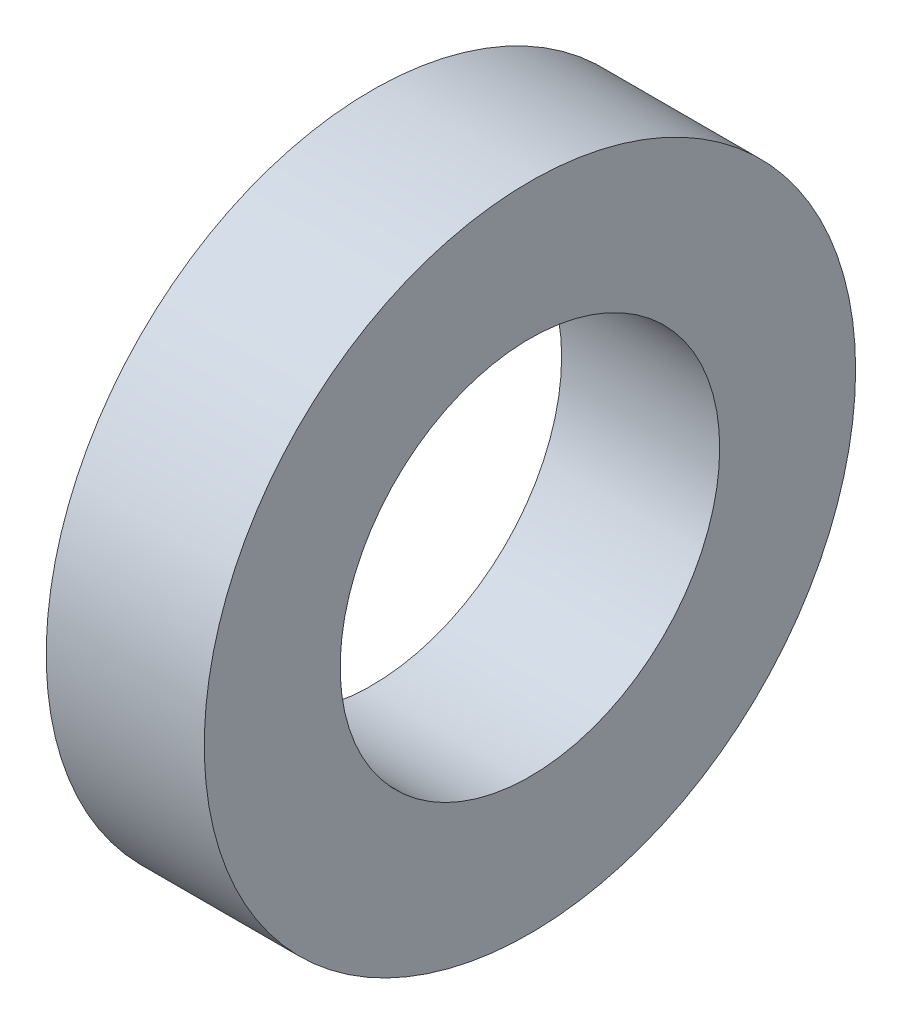
ISO-10303-21;
HEADER;
FILE_DESCRIPTION(('STEP AP214'),'2;1');
FILE_NAME('part.step','',(''),(''),'','','');
FILE_SCHEMA(('AUTOMOTIVE_DESIGN { 1 0 10303 214 1 1 1 1 }'));
ENDSEC;
DATA;
#1=APPLICATION_CONTEXT('core data for automotive mechanical design processes');
#2=APPLICATION_PROTOCOL_DEFINITION('international standard','automotive_design',2000,#1);
#3=PRODUCT_CONTEXT('',#1,'mechanical');
#4=PRODUCT('Part','Part','',(#3));
#5=PRODUCT_RELATED_PRODUCT_CATEGORY('part','',(#4));
#6=PRODUCT_DEFINITION_FORMATION('','',#4);
#7=PRODUCT_DEFINITION_CONTEXT('part definition',#1,'design');
#8=PRODUCT_DEFINITION('design','',#6,#7);
#9=PRODUCT_DEFINITION_SHAPE('','',#8);
#10=(LENGTH_UNIT() NAMED_UNIT(*) SI_UNIT(.MILLI.,.METRE.));
#11=(NAMED_UNIT(*) PLANE_ANGLE_UNIT() SI_UNIT($,.RADIAN.));
#12=(NAMED_UNIT(*) SI_UNIT($,.STERADIAN.) SOLID_ANGLE_UNIT());
#13=UNCERTAINTY_MEASURE_WITH_UNIT(LENGTH_MEASURE(1.E-05),#10,'distance_accuracy_value','');
#14=(GEOMETRIC_REPRESENTATION_CONTEXT(3) GLOBAL_UNCERTAINTY_ASSIGNED_CONTEXT((#13)) GLOBAL_UNIT_ASSIGNED_CONTEXT((#10,
#11,#12)) REPRESENTATION_CONTEXT('',''));
#15=CARTESIAN_POINT('',(0.,0.,0.));
#16=DIRECTION('',(0.,0.,1.));
#17=DIRECTION('',(1.,0.,0.));
#18=AXIS2_PLACEMENT_3D('',#15,#16,#17);
#19=CARTESIAN_POINT('',(4.6228,0.,0.));
#20=DIRECTION('',(1.,0.,0.));
#21=DIRECTION('',(0.,0.,-1.));
#22=AXIS2_PLACEMENT_3D('',#19,#20,#21);
#23=PLANE('',#22);
#24=CARTESIAN_POINT('',(4.6228,0.,0.));
#25=DIRECTION('',(1.,0.,0.));
#26=DIRECTION('',(0.,0.,-1.));
#27=AXIS2_PLACEMENT_3D('',#24,#25,#26);
#28=CIRCLE('',#27,9.525);
#29=CARTESIAN_POINT('',(4.6228,0.,-9.525));
#30=VERTEX_POINT('',#29);
#31=EDGE_CURVE('E10',#30,#30,#28,.T.);
#32=ORIENTED_EDGE('',*,*,#31,.T.);
#33=EDGE_LOOP('',(#32));
#34=FACE_BOUND('',#33,.T.);
#35=CARTESIAN_POINT('',(4.6228,0.,0.));
#36=DIRECTION('',(1.,0.,0.));
#37=DIRECTION('',(0.,0.,-1.));
#38=AXIS2_PLACEMENT_3D('',#35,#36,#37);
#39=CIRCLE('',#38,5.55006131403119);
#40=CARTESIAN_POINT('',(4.6228,0.,-5.55006131403119));
#41=VERTEX_POINT('',#40);
#42=EDGE_CURVE('E54',#41,#41,#39,.T.);
#43=ORIENTED_EDGE('',*,*,#42,.F.);
#44=EDGE_LOOP('',(#43));
#45=FACE_BOUND('',#44,.T.);
#46=ADVANCED_FACE('F41',(#34,#45),#23,.T.);
#47=CARTESIAN_POINT('',(0.,0.,0.));
#48=DIRECTION('',(1.,0.,0.));
#49=DIRECTION('',(0.,0.,-1.));
#50=AXIS2_PLACEMENT_3D('',#47,#48,#49);
#51=PLANE('',#50);
#52=CARTESIAN_POINT('',(0.,0.,0.));
#53=DIRECTION('',(1.,0.,0.));
#54=DIRECTION('',(0.,0.,-1.));
#55=AXIS2_PLACEMENT_3D('',#52,#53,#54);
#56=CIRCLE('',#55,9.525);
#57=CARTESIAN_POINT('',(0.,0.,-9.525));
#58=VERTEX_POINT('',#57);
#59=EDGE_CURVE('E45',#58,#58,#56,.T.);
#60=ORIENTED_EDGE('',*,*,#59,.F.);
#61=EDGE_LOOP('',(#60));
#62=FACE_BOUND('',#61,.T.);
#63=CARTESIAN_POINT('',(0.,0.,0.));
#64=DIRECTION('',(1.,0.,0.));
#65=DIRECTION('',(0.,0.,-1.));
#66=AXIS2_PLACEMENT_3D('',#63,#64,#65);
#67=CIRCLE('',#66,5.55006131403119);
#68=CARTESIAN_POINT('',(0.,0.,-5.55006131403119));
#69=VERTEX_POINT('',#68);
#70=EDGE_CURVE('E56',#69,#69,#67,.T.);
#71=ORIENTED_EDGE('',*,*,#70,.T.);
#72=EDGE_LOOP('',(#71));
#73=FACE_BOUND('',#72,.T.);
#74=ADVANCED_FACE('F68',(#62,#73),#51,.F.);
#75=CARTESIAN_POINT('',(4.6228,0.,0.));
#76=DIRECTION('',(-1.,0.,0.));
#77=DIRECTION('',(0.,0.,1.));
#78=AXIS2_PLACEMENT_3D('',#75,#76,#77);
#79=CYLINDRICAL_SURFACE('',#78,9.525);
#80=ORIENTED_EDGE('',*,*,#31,.F.);
#81=EDGE_LOOP('',(#80));
#82=FACE_BOUND('',#81,.T.);
#83=ORIENTED_EDGE('',*,*,#59,.T.);
#84=EDGE_LOOP('',(#83));
#85=FACE_BOUND('',#84,.T.);
#86=ADVANCED_FACE('F43',(#82,#85),#79,.T.);
#87=CARTESIAN_POINT('',(4.6228,0.,0.));
#88=DIRECTION('',(-1.,0.,0.));
#89=DIRECTION('',(0.,0.,1.));
#90=AXIS2_PLACEMENT_3D('',#87,#88,#89);
#91=CYLINDRICAL_SURFACE('',#90,5.55006131403119);
#92=ORIENTED_EDGE('',*,*,#42,.T.);
#93=EDGE_LOOP('',(#92));
#94=FACE_BOUND('',#93,.T.);
#95=ORIENTED_EDGE('',*,*,#70,.F.);
#96=EDGE_LOOP('',(#95));
#97=FACE_BOUND('',#96,.T.);
#98=ADVANCED_FACE('F64',(#94,#97),#91,.F.);
#99=CLOSED_SHELL('',(#46,#74,#86,#98));
#100=MANIFOLD_SOLID_BREP('B2',#99);
#101=ADVANCED_BREP_SHAPE_REPRESENTATION('',(#18,#100),#14);
#102=SHAPE_DEFINITION_REPRESENTATION(#9,#101);
ENDSEC;
END-ISO-10303-21;
